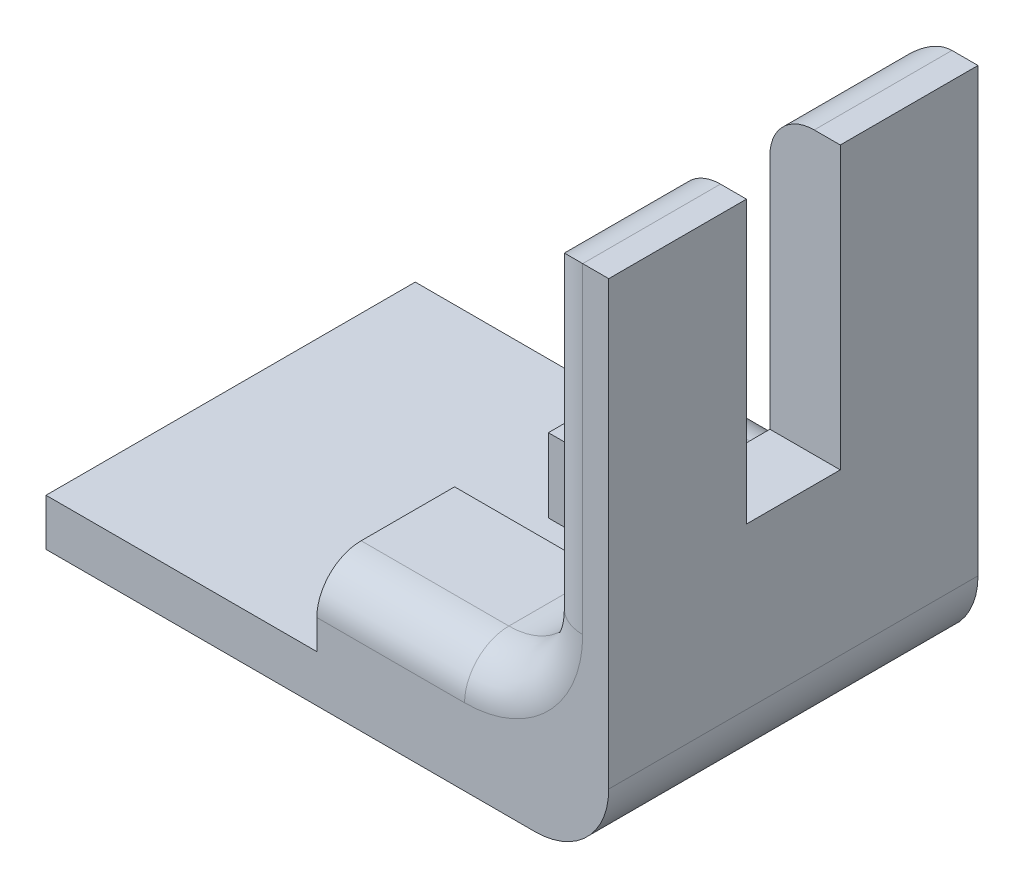
ISO-10303-21;
HEADER;
FILE_DESCRIPTION(('STEP AP214'),'2;1');
FILE_NAME('part.step','',(''),(''),'','','');
FILE_SCHEMA(('AUTOMOTIVE_DESIGN { 1 0 10303 214 1 1 1 1 }'));
ENDSEC;
DATA;
#1=APPLICATION_CONTEXT('core data for automotive mechanical design processes');
#2=APPLICATION_PROTOCOL_DEFINITION('international standard','automotive_design',2000,#1);
#3=PRODUCT_CONTEXT('',#1,'mechanical');
#4=PRODUCT('Part','Part','',(#3));
#5=PRODUCT_RELATED_PRODUCT_CATEGORY('part','',(#4));
#6=PRODUCT_DEFINITION_FORMATION('','',#4);
#7=PRODUCT_DEFINITION_CONTEXT('part definition',#1,'design');
#8=PRODUCT_DEFINITION('design','',#6,#7);
#9=PRODUCT_DEFINITION_SHAPE('','',#8);
#10=(LENGTH_UNIT() NAMED_UNIT(*) SI_UNIT(.MILLI.,.METRE.));
#11=(NAMED_UNIT(*) PLANE_ANGLE_UNIT() SI_UNIT($,.RADIAN.));
#12=(NAMED_UNIT(*) SI_UNIT($,.STERADIAN.) SOLID_ANGLE_UNIT());
#13=UNCERTAINTY_MEASURE_WITH_UNIT(LENGTH_MEASURE(1.E-05),#10,'distance_accuracy_value','');
#14=(GEOMETRIC_REPRESENTATION_CONTEXT(3) GLOBAL_UNCERTAINTY_ASSIGNED_CONTEXT((#13)) GLOBAL_UNIT_ASSIGNED_CONTEXT((#10,
#11,#12)) REPRESENTATION_CONTEXT('',''));
#15=CARTESIAN_POINT('',(0.,0.,0.));
#16=DIRECTION('',(0.,0.,1.));
#17=DIRECTION('',(1.,0.,0.));
#18=AXIS2_PLACEMENT_3D('',#15,#16,#17);
#19=CARTESIAN_POINT('',(-18.8607042124503,16.35,-11.4501236802198));
#20=DIRECTION('',(1.,0.,0.));
#21=DIRECTION('',(0.,0.,-1.));
#22=AXIS2_PLACEMENT_3D('',#19,#20,#21);
#23=PLANE('',#22);
#24=DIRECTION('',(0.,-1.,0.));
#25=VECTOR('',#24,1.);
#26=CARTESIAN_POINT('',(-18.8607042124503,16.35,38.5498763197802));
#27=LINE('',#26,#25);
#28=CARTESIAN_POINT('',(-18.8607042124503,10.35,38.5498763197802));
#29=VERTEX_POINT('',#28);
#30=CARTESIAN_POINT('',(-18.8607042124503,6.35,38.5498763197802));
#31=VERTEX_POINT('',#30);
#32=EDGE_CURVE('E237',#29,#31,#27,.T.);
#33=ORIENTED_EDGE('',*,*,#32,.F.);
#34=CARTESIAN_POINT('',(-18.8607042124503,10.35,32.5498763197802));
#35=DIRECTION('',(1.,0.,0.));
#36=DIRECTION('',(0.,0.,-1.));
#37=AXIS2_PLACEMENT_3D('',#34,#35,#36);
#38=CIRCLE('',#37,6.);
#39=CARTESIAN_POINT('',(-18.8607042124503,16.35,32.5498763197802));
#40=VERTEX_POINT('',#39);
#41=EDGE_CURVE('E333',#29,#40,#38,.F.);
#42=ORIENTED_EDGE('',*,*,#41,.T.);
#43=DIRECTION('',(0.,0.,1.));
#44=VECTOR('',#43,1.);
#45=CARTESIAN_POINT('',(-18.8607042124503,16.35,-11.4501236802198));
#46=LINE('',#45,#44);
#47=CARTESIAN_POINT('',(-18.8607042124503,16.35,19.8998763197802));
#48=VERTEX_POINT('',#47);
#49=EDGE_CURVE('E238',#48,#40,#46,.T.);
#50=ORIENTED_EDGE('',*,*,#49,.F.);
#51=DIRECTION('',(0.,1.,0.));
#52=VECTOR('',#51,1.);
#53=CARTESIAN_POINT('',(-18.8607042124503,6.35,19.8998763197802));
#54=LINE('',#53,#52);
#55=CARTESIAN_POINT('',(-18.8607042124503,6.35,19.8998763197802));
#56=VERTEX_POINT('',#55);
#57=EDGE_CURVE('E232',#56,#48,#54,.T.);
#58=ORIENTED_EDGE('',*,*,#57,.F.);
#59=DIRECTION('',(0.,0.,1.));
#60=VECTOR('',#59,1.);
#61=CARTESIAN_POINT('',(-18.8607042124503,6.35,-11.4501236802198));
#62=LINE('',#61,#60);
#63=EDGE_CURVE('E231',#56,#31,#62,.T.);
#64=ORIENTED_EDGE('',*,*,#63,.T.);
#65=EDGE_LOOP('',(#33,#42,#50,#58,#64));
#66=FACE_BOUND('',#65,.T.);
#67=ADVANCED_FACE('F35',(#66),#23,.F.);
#68=CARTESIAN_POINT('',(0.,16.35,0.));
#69=DIRECTION('',(0.,-1.,0.));
#70=DIRECTION('',(0.,0.,-1.));
#71=AXIS2_PLACEMENT_3D('',#68,#69,#70);
#72=PLANE('',#71);
#73=ORIENTED_EDGE('',*,*,#49,.T.);
#74=DIRECTION('',(1.,0.,0.));
#75=VECTOR('',#74,1.);
#76=CARTESIAN_POINT('',(0.,16.35,32.5498763197802));
#77=LINE('',#76,#75);
#78=CARTESIAN_POINT('',(1.1392957875497,16.35,32.5498763197802));
#79=VERTEX_POINT('',#78);
#80=EDGE_CURVE('E324',#40,#79,#77,.T.);
#81=ORIENTED_EDGE('',*,*,#80,.T.);
#82=DIRECTION('',(0.,0.,-1.));
#83=VECTOR('',#82,1.);
#84=CARTESIAN_POINT('',(1.1392957875497,16.35,19.8998763197802));
#85=LINE('',#84,#83);
#86=CARTESIAN_POINT('',(1.13929578754969,16.35,19.8998763197802));
#87=VERTEX_POINT('',#86);
#88=EDGE_CURVE('E304',#79,#87,#85,.T.);
#89=ORIENTED_EDGE('',*,*,#88,.T.);
#90=DIRECTION('',(1.,0.,0.));
#91=VECTOR('',#90,1.);
#92=CARTESIAN_POINT('',(-18.8607042124503,16.35,19.8998763197802));
#93=LINE('',#92,#91);
#94=EDGE_CURVE('E220',#48,#87,#93,.T.);
#95=ORIENTED_EDGE('',*,*,#94,.F.);
#96=EDGE_LOOP('',(#73,#81,#89,#95));
#97=FACE_BOUND('',#96,.T.);
#98=ADVANCED_FACE('F468',(#97),#72,.F.);
#99=CARTESIAN_POINT('',(0.,6.35,0.));
#100=DIRECTION('',(0.,1.,0.));
#101=DIRECTION('',(0.,0.,1.));
#102=AXIS2_PLACEMENT_3D('',#99,#100,#101);
#103=PLANE('',#102);
#104=DIRECTION('',(1.,0.,0.));
#105=VECTOR('',#104,1.);
#106=CARTESIAN_POINT('',(-55.5357042124503,6.35,38.5498763197802));
#107=LINE('',#106,#105);
#108=CARTESIAN_POINT('',(-55.5357042124503,6.35,38.5498763197802));
#109=VERTEX_POINT('',#108);
#110=EDGE_CURVE('E279',#109,#31,#107,.T.);
#111=ORIENTED_EDGE('',*,*,#110,.T.);
#112=ORIENTED_EDGE('',*,*,#63,.F.);
#113=DIRECTION('',(1.,0.,0.));
#114=VECTOR('',#113,1.);
#115=CARTESIAN_POINT('',(-18.8607042124503,6.35,19.8998763197802));
#116=LINE('',#115,#114);
#117=CARTESIAN_POINT('',(11.1392957875497,6.35,19.8998763197802));
#118=VERTEX_POINT('',#117);
#119=EDGE_CURVE('E206',#56,#118,#116,.T.);
#120=ORIENTED_EDGE('',*,*,#119,.T.);
#121=DIRECTION('',(0.,0.,-1.));
#122=VECTOR('',#121,1.);
#123=CARTESIAN_POINT('',(11.1392957875497,6.35,19.8998763197802));
#124=LINE('',#123,#122);
#125=CARTESIAN_POINT('',(11.1392957875497,6.35,7.1998763197802));
#126=VERTEX_POINT('',#125);
#127=EDGE_CURVE('E199',#118,#126,#124,.T.);
#128=ORIENTED_EDGE('',*,*,#127,.T.);
#129=DIRECTION('',(-1.,0.,0.));
#130=VECTOR('',#129,1.);
#131=CARTESIAN_POINT('',(-18.8607042124503,6.35,7.1998763197802));
#132=LINE('',#131,#130);
#133=CARTESIAN_POINT('',(-18.8607042124503,6.35,7.1998763197802));
#134=VERTEX_POINT('',#133);
#135=EDGE_CURVE('E209',#126,#134,#132,.T.);
#136=ORIENTED_EDGE('',*,*,#135,.T.);
#137=CARTESIAN_POINT('',(-18.8607042124503,6.35,-11.4501236802198));
#138=VERTEX_POINT('',#137);
#139=EDGE_CURVE('E239',#138,#134,#62,.T.);
#140=ORIENTED_EDGE('',*,*,#139,.F.);
#141=DIRECTION('',(-1.,0.,0.));
#142=VECTOR('',#141,1.);
#143=CARTESIAN_POINT('',(-55.5357042124503,6.35,-11.4501236802198));
#144=LINE('',#143,#142);
#145=CARTESIAN_POINT('',(-55.5357042124503,6.35,-11.4501236802198));
#146=VERTEX_POINT('',#145);
#147=EDGE_CURVE('E288',#138,#146,#144,.T.);
#148=ORIENTED_EDGE('',*,*,#147,.T.);
#149=DIRECTION('',(0.,0.,1.));
#150=VECTOR('',#149,1.);
#151=CARTESIAN_POINT('',(-55.5357042124503,6.35,-11.4501236802198));
#152=LINE('',#151,#150);
#153=EDGE_CURVE('E276',#146,#109,#152,.T.);
#154=ORIENTED_EDGE('',*,*,#153,.T.);
#155=EDGE_LOOP('',(#111,#112,#120,#128,#136,#140,#148,#154));
#156=FACE_BOUND('',#155,.T.);
#157=ADVANCED_FACE('F218',(#156),#103,.T.);
#158=CARTESIAN_POINT('',(11.1392957875497,69.85,-11.4501236802198));
#159=DIRECTION('',(1.,0.,0.));
#160=DIRECTION('',(0.,0.,-1.));
#161=AXIS2_PLACEMENT_3D('',#158,#159,#160);
#162=PLANE('',#161);
#163=DIRECTION('',(0.,0.,-1.));
#164=VECTOR('',#163,1.);
#165=CARTESIAN_POINT('',(11.1392957875497,26.35,38.5498763197802));
#166=LINE('',#165,#164);
#167=CARTESIAN_POINT('',(11.1392957875497,26.35,19.8998763197802));
#168=VERTEX_POINT('',#167);
#169=CARTESIAN_POINT('',(11.1392957875497,26.35,32.5498763197802));
#170=VERTEX_POINT('',#169);
#171=EDGE_CURVE('E301',#168,#170,#166,.F.);
#172=ORIENTED_EDGE('',*,*,#171,.T.);
#173=DIRECTION('',(0.,-1.,0.));
#174=VECTOR('',#173,1.);
#175=CARTESIAN_POINT('',(11.1392957875497,69.85,32.5498763197802));
#176=LINE('',#175,#174);
#177=CARTESIAN_POINT('',(11.1392957875497,63.85,32.5498763197802));
#178=VERTEX_POINT('',#177);
#179=EDGE_CURVE('E343',#170,#178,#176,.F.);
#180=ORIENTED_EDGE('',*,*,#179,.T.);
#181=DIRECTION('',(0.,0.,1.));
#182=VECTOR('',#181,1.);
#183=CARTESIAN_POINT('',(11.1392957875497,63.85,-11.4501236802198));
#184=LINE('',#183,#182);
#185=CARTESIAN_POINT('',(11.1392957875497,63.85,19.8998763197802));
#186=VERTEX_POINT('',#185);
#187=EDGE_CURVE('E341',#178,#186,#184,.F.);
#188=ORIENTED_EDGE('',*,*,#187,.T.);
#189=DIRECTION('',(0.,1.,0.));
#190=VECTOR('',#189,1.);
#191=CARTESIAN_POINT('',(11.1392957875497,31.75,19.8998763197802));
#192=LINE('',#191,#190);
#193=CARTESIAN_POINT('',(11.1392957875497,31.75,19.8998763197802));
#194=VERTEX_POINT('',#193);
#195=EDGE_CURVE('E249',#194,#186,#192,.T.);
#196=ORIENTED_EDGE('',*,*,#195,.F.);
#197=DIRECTION('',(0.,0.,1.));
#198=VECTOR('',#197,1.);
#199=CARTESIAN_POINT('',(11.1392957875497,31.75,19.8998763197802));
#200=LINE('',#199,#198);
#201=CARTESIAN_POINT('',(11.1392957875497,31.75,7.1998763197802));
#202=VERTEX_POINT('',#201);
#203=EDGE_CURVE('E246',#202,#194,#200,.T.);
#204=ORIENTED_EDGE('',*,*,#203,.F.);
#205=DIRECTION('',(0.,-1.,0.));
#206=VECTOR('',#205,1.);
#207=CARTESIAN_POINT('',(11.1392957875497,31.75,7.1998763197802));
#208=LINE('',#207,#206);
#209=CARTESIAN_POINT('',(11.1392957875497,63.85,7.1998763197802));
#210=VERTEX_POINT('',#209);
#211=EDGE_CURVE('E244',#210,#202,#208,.T.);
#212=ORIENTED_EDGE('',*,*,#211,.F.);
#213=DIRECTION('',(0.,0.,1.));
#214=VECTOR('',#213,1.);
#215=CARTESIAN_POINT('',(11.1392957875497,63.85,-11.4501236802198));
#216=LINE('',#215,#214);
#217=CARTESIAN_POINT('',(11.1392957875497,63.85,-5.4501236802198));
#218=VERTEX_POINT('',#217);
#219=EDGE_CURVE('E337',#210,#218,#216,.F.);
#220=ORIENTED_EDGE('',*,*,#219,.T.);
#221=DIRECTION('',(0.,-1.,0.));
#222=VECTOR('',#221,1.);
#223=CARTESIAN_POINT('',(11.1392957875497,69.85,-5.4501236802198));
#224=LINE('',#223,#222);
#225=CARTESIAN_POINT('',(11.1392957875497,26.35,-5.4501236802198));
#226=VERTEX_POINT('',#225);
#227=EDGE_CURVE('E339',#218,#226,#224,.T.);
#228=ORIENTED_EDGE('',*,*,#227,.T.);
#229=DIRECTION('',(0.,0.,-1.));
#230=VECTOR('',#229,1.);
#231=CARTESIAN_POINT('',(11.1392957875497,26.35,7.1998763197802));
#232=LINE('',#231,#230);
#233=CARTESIAN_POINT('',(11.1392957875497,26.35,7.1998763197802));
#234=VERTEX_POINT('',#233);
#235=EDGE_CURVE('E202',#226,#234,#232,.F.);
#236=ORIENTED_EDGE('',*,*,#235,.T.);
#237=DIRECTION('',(0.,1.,0.));
#238=VECTOR('',#237,1.);
#239=CARTESIAN_POINT('',(11.1392957875497,6.35,7.1998763197802));
#240=LINE('',#239,#238);
#241=EDGE_CURVE('E194',#126,#234,#240,.T.);
#242=ORIENTED_EDGE('',*,*,#241,.F.);
#243=ORIENTED_EDGE('',*,*,#127,.F.);
#244=DIRECTION('',(0.,1.,0.));
#245=VECTOR('',#244,1.);
#246=CARTESIAN_POINT('',(11.1392957875497,6.35,19.8998763197802));
#247=LINE('',#246,#245);
#248=EDGE_CURVE('E229',#118,#168,#247,.T.);
#249=ORIENTED_EDGE('',*,*,#248,.T.);
#250=EDGE_LOOP('',(#172,#180,#188,#196,#204,#212,#220,#228,#236,#242,#243,#249));
#251=FACE_BOUND('',#250,.T.);
#252=ADVANCED_FACE('F197',(#251),#162,.F.);
#253=CARTESIAN_POINT('',(0.,69.85,0.));
#254=DIRECTION('',(0.,-1.,0.));
#255=DIRECTION('',(0.,0.,-1.));
#256=AXIS2_PLACEMENT_3D('',#253,#254,#255);
#257=PLANE('',#256);
#258=DIRECTION('',(-1.,0.,0.));
#259=VECTOR('',#258,1.);
#260=CARTESIAN_POINT('',(20.6642957875497,69.85,-11.4501236802198));
#261=LINE('',#260,#259);
#262=CARTESIAN_POINT('',(20.6642957875497,69.85,-11.4501236802198));
#263=VERTEX_POINT('',#262);
#264=CARTESIAN_POINT('',(17.1392957875497,69.85,-11.4501236802198));
#265=VERTEX_POINT('',#264);
#266=EDGE_CURVE('E270',#263,#265,#261,.T.);
#267=ORIENTED_EDGE('',*,*,#266,.T.);
#268=DIRECTION('',(0.,0.,1.));
#269=VECTOR('',#268,1.);
#270=CARTESIAN_POINT('',(17.1392957875497,69.85,0.));
#271=LINE('',#270,#269);
#272=CARTESIAN_POINT('',(17.1392957875497,69.85,7.1998763197802));
#273=VERTEX_POINT('',#272);
#274=EDGE_CURVE('E349',#265,#273,#271,.T.);
#275=ORIENTED_EDGE('',*,*,#274,.T.);
#276=DIRECTION('',(1.,0.,0.));
#277=VECTOR('',#276,1.);
#278=CARTESIAN_POINT('',(0.,69.85,7.1998763197802));
#279=LINE('',#278,#277);
#280=CARTESIAN_POINT('',(20.6642957875497,69.85,7.19987631978019));
#281=VERTEX_POINT('',#280);
#282=EDGE_CURVE('E294',#273,#281,#279,.T.);
#283=ORIENTED_EDGE('',*,*,#282,.T.);
#284=DIRECTION('',(0.,0.,-1.));
#285=VECTOR('',#284,1.);
#286=CARTESIAN_POINT('',(20.6642957875497,69.85,-11.4501236802198));
#287=LINE('',#286,#285);
#288=EDGE_CURVE('E266',#281,#263,#287,.T.);
#289=ORIENTED_EDGE('',*,*,#288,.T.);
#290=EDGE_LOOP('',(#267,#275,#283,#289));
#291=FACE_BOUND('',#290,.T.);
#292=ADVANCED_FACE('F430',(#291),#257,.F.);
#293=CARTESIAN_POINT('',(-55.5357042124503,6.35,-11.4501236802198));
#294=DIRECTION('',(1.,0.,0.));
#295=DIRECTION('',(0.,0.,-1.));
#296=AXIS2_PLACEMENT_3D('',#293,#294,#295);
#297=PLANE('',#296);
#298=DIRECTION('',(0.,0.,1.));
#299=VECTOR('',#298,1.);
#300=CARTESIAN_POINT('',(-55.5357042124503,0.,-11.4501236802198));
#301=LINE('',#300,#299);
#302=CARTESIAN_POINT('',(-55.5357042124503,0.,-11.4501236802198));
#303=VERTEX_POINT('',#302);
#304=CARTESIAN_POINT('',(-55.5357042124503,0.,38.5498763197802));
#305=VERTEX_POINT('',#304);
#306=EDGE_CURVE('E275',#303,#305,#301,.T.);
#307=ORIENTED_EDGE('',*,*,#306,.T.);
#308=DIRECTION('',(0.,-1.,0.));
#309=VECTOR('',#308,1.);
#310=CARTESIAN_POINT('',(-55.5357042124503,6.35,38.5498763197802));
#311=LINE('',#310,#309);
#312=EDGE_CURVE('E289',#109,#305,#311,.T.);
#313=ORIENTED_EDGE('',*,*,#312,.F.);
#314=ORIENTED_EDGE('',*,*,#153,.F.);
#315=DIRECTION('',(0.,-1.,0.));
#316=VECTOR('',#315,1.);
#317=CARTESIAN_POINT('',(-55.5357042124503,6.35,-11.4501236802198));
#318=LINE('',#317,#316);
#319=EDGE_CURVE('E298',#146,#303,#318,.T.);
#320=ORIENTED_EDGE('',*,*,#319,.T.);
#321=EDGE_LOOP('',(#307,#313,#314,#320));
#322=FACE_BOUND('',#321,.T.);
#323=ADVANCED_FACE('F396',(#322),#297,.F.);
#324=CARTESIAN_POINT('',(-55.5357042124503,6.35,38.5498763197802));
#325=DIRECTION('',(0.,0.,-1.));
#326=DIRECTION('',(-1.,0.,0.));
#327=AXIS2_PLACEMENT_3D('',#324,#325,#326);
#328=PLANE('',#327);
#329=DIRECTION('',(1.,0.,0.));
#330=VECTOR('',#329,1.);
#331=CARTESIAN_POINT('',(-55.5357042124503,0.,38.5498763197802));
#332=LINE('',#331,#330);
#333=CARTESIAN_POINT('',(10.6642957875497,0.,38.5498763197802));
#334=VERTEX_POINT('',#333);
#335=EDGE_CURVE('E391',#305,#334,#332,.T.);
#336=ORIENTED_EDGE('',*,*,#335,.T.);
#337=CARTESIAN_POINT('',(10.6642957875497,10.,38.5498763197802));
#338=DIRECTION('',(0.,0.,-1.));
#339=DIRECTION('',(-1.,0.,0.));
#340=AXIS2_PLACEMENT_3D('',#337,#338,#339);
#341=CIRCLE('',#340,10.);
#342=CARTESIAN_POINT('',(20.6642957875497,10.,38.5498763197802));
#343=VERTEX_POINT('',#342);
#344=EDGE_CURVE('E11',#334,#343,#341,.F.);
#345=ORIENTED_EDGE('',*,*,#344,.T.);
#346=DIRECTION('',(0.,-1.,0.));
#347=VECTOR('',#346,1.);
#348=CARTESIAN_POINT('',(20.6642957875497,6.35,38.5498763197802));
#349=LINE('',#348,#347);
#350=CARTESIAN_POINT('',(20.6642957875497,69.85,38.5498763197802));
#351=VERTEX_POINT('',#350);
#352=EDGE_CURVE('E382',#351,#343,#349,.T.);
#353=ORIENTED_EDGE('',*,*,#352,.F.);
#354=DIRECTION('',(1.,0.,0.));
#355=VECTOR('',#354,1.);
#356=CARTESIAN_POINT('',(20.6642957875497,69.85,38.5498763197802));
#357=LINE('',#356,#355);
#358=CARTESIAN_POINT('',(17.1392957875497,69.85,38.5498763197802));
#359=VERTEX_POINT('',#358);
#360=EDGE_CURVE('E273',#359,#351,#357,.T.);
#361=ORIENTED_EDGE('',*,*,#360,.F.);
#362=DIRECTION('',(0.,-1.,0.));
#363=VECTOR('',#362,1.);
#364=CARTESIAN_POINT('',(17.1392957875497,6.35,38.5498763197802));
#365=LINE('',#364,#363);
#366=CARTESIAN_POINT('',(17.1392957875497,26.35,38.5498763197802));
#367=VERTEX_POINT('',#366);
#368=EDGE_CURVE('E327',#359,#367,#365,.T.);
#369=ORIENTED_EDGE('',*,*,#368,.T.);
#370=CARTESIAN_POINT('',(1.1392957875497,26.35,38.5498763197802));
#371=DIRECTION('',(0.,0.,-1.));
#372=DIRECTION('',(-1.,0.,0.));
#373=AXIS2_PLACEMENT_3D('',#370,#371,#372);
#374=CIRCLE('',#373,16.);
#375=CARTESIAN_POINT('',(1.1392957875497,10.35,38.5498763197802));
#376=VERTEX_POINT('',#375);
#377=EDGE_CURVE('E329',#367,#376,#374,.T.);
#378=ORIENTED_EDGE('',*,*,#377,.T.);
#379=DIRECTION('',(1.,0.,0.));
#380=VECTOR('',#379,1.);
#381=CARTESIAN_POINT('',(-55.5357042124503,10.35,38.5498763197802));
#382=LINE('',#381,#380);
#383=EDGE_CURVE('E331',#376,#29,#382,.F.);
#384=ORIENTED_EDGE('',*,*,#383,.T.);
#385=ORIENTED_EDGE('',*,*,#32,.T.);
#386=ORIENTED_EDGE('',*,*,#110,.F.);
#387=ORIENTED_EDGE('',*,*,#312,.T.);
#388=EDGE_LOOP('',(#336,#345,#353,#361,#369,#378,#384,#385,#386,#387));
#389=FACE_BOUND('',#388,.T.);
#390=ADVANCED_FACE('F402',(#389),#328,.F.);
#391=CARTESIAN_POINT('',(20.6642957875497,6.35,-11.4501236802198));
#392=DIRECTION('',(-1.,0.,0.));
#393=DIRECTION('',(0.,0.,1.));
#394=AXIS2_PLACEMENT_3D('',#391,#392,#393);
#395=PLANE('',#394);
#396=ORIENTED_EDGE('',*,*,#352,.T.);
#397=DIRECTION('',(0.,0.,-1.));
#398=VECTOR('',#397,1.);
#399=CARTESIAN_POINT('',(20.6642957875497,10.,-11.4501236802198));
#400=LINE('',#399,#398);
#401=CARTESIAN_POINT('',(20.6642957875497,10.,-11.4501236802198));
#402=VERTEX_POINT('',#401);
#403=EDGE_CURVE('E353',#343,#402,#400,.T.);
#404=ORIENTED_EDGE('',*,*,#403,.T.);
#405=DIRECTION('',(0.,-1.,0.));
#406=VECTOR('',#405,1.);
#407=CARTESIAN_POINT('',(20.6642957875497,6.35,-11.4501236802198));
#408=LINE('',#407,#406);
#409=EDGE_CURVE('E378',#263,#402,#408,.T.);
#410=ORIENTED_EDGE('',*,*,#409,.F.);
#411=ORIENTED_EDGE('',*,*,#288,.F.);
#412=DIRECTION('',(0.,-1.,0.));
#413=VECTOR('',#412,1.);
#414=CARTESIAN_POINT('',(20.6642957875497,6.35,7.1998763197802));
#415=LINE('',#414,#413);
#416=CARTESIAN_POINT('',(20.6642957875497,31.75,7.1998763197802));
#417=VERTEX_POINT('',#416);
#418=EDGE_CURVE('E260',#281,#417,#415,.T.);
#419=ORIENTED_EDGE('',*,*,#418,.T.);
#420=DIRECTION('',(0.,0.,1.));
#421=VECTOR('',#420,1.);
#422=CARTESIAN_POINT('',(20.6642957875497,31.75,-11.4501236802198));
#423=LINE('',#422,#421);
#424=CARTESIAN_POINT('',(20.6642957875497,31.75,19.8998763197802));
#425=VERTEX_POINT('',#424);
#426=EDGE_CURVE('E263',#417,#425,#423,.T.);
#427=ORIENTED_EDGE('',*,*,#426,.T.);
#428=DIRECTION('',(0.,1.,0.));
#429=VECTOR('',#428,1.);
#430=CARTESIAN_POINT('',(20.6642957875497,6.35,19.8998763197802));
#431=LINE('',#430,#429);
#432=CARTESIAN_POINT('',(20.6642957875497,69.85,19.8998763197802));
#433=VERTEX_POINT('',#432);
#434=EDGE_CURVE('E255',#425,#433,#431,.T.);
#435=ORIENTED_EDGE('',*,*,#434,.T.);
#436=EDGE_CURVE('E267',#351,#433,#287,.T.);
#437=ORIENTED_EDGE('',*,*,#436,.F.);
#438=EDGE_LOOP('',(#396,#404,#410,#411,#419,#427,#435,#437));
#439=FACE_BOUND('',#438,.T.);
#440=ADVANCED_FACE('F376',(#439),#395,.F.);
#441=CARTESIAN_POINT('',(-55.5357042124503,6.35,-11.4501236802198));
#442=DIRECTION('',(0.,0.,1.));
#443=DIRECTION('',(1.,0.,0.));
#444=AXIS2_PLACEMENT_3D('',#441,#442,#443);
#445=PLANE('',#444);
#446=ORIENTED_EDGE('',*,*,#409,.T.);
#447=CARTESIAN_POINT('',(10.6642957875497,10.,-11.4501236802198));
#448=DIRECTION('',(0.,0.,1.));
#449=DIRECTION('',(1.,0.,0.));
#450=AXIS2_PLACEMENT_3D('',#447,#448,#449);
#451=CIRCLE('',#450,10.);
#452=CARTESIAN_POINT('',(10.6642957875497,0.,-11.4501236802198));
#453=VERTEX_POINT('',#452);
#454=EDGE_CURVE('E57',#402,#453,#451,.F.);
#455=ORIENTED_EDGE('',*,*,#454,.T.);
#456=DIRECTION('',(-1.,0.,0.));
#457=VECTOR('',#456,1.);
#458=CARTESIAN_POINT('',(-55.5357042124503,0.,-11.4501236802198));
#459=LINE('',#458,#457);
#460=EDGE_CURVE('E280',#453,#303,#459,.T.);
#461=ORIENTED_EDGE('',*,*,#460,.T.);
#462=ORIENTED_EDGE('',*,*,#319,.F.);
#463=ORIENTED_EDGE('',*,*,#147,.F.);
#464=DIRECTION('',(0.,-1.,0.));
#465=VECTOR('',#464,1.);
#466=CARTESIAN_POINT('',(-18.8607042124503,16.35,-11.4501236802198));
#467=LINE('',#466,#465);
#468=CARTESIAN_POINT('',(-18.8607042124503,10.35,-11.4501236802198));
#469=VERTEX_POINT('',#468);
#470=EDGE_CURVE('E242',#469,#138,#467,.T.);
#471=ORIENTED_EDGE('',*,*,#470,.F.);
#472=DIRECTION('',(-1.,0.,0.));
#473=VECTOR('',#472,1.);
#474=CARTESIAN_POINT('',(-55.5357042124503,10.35,-11.4501236802198));
#475=LINE('',#474,#473);
#476=CARTESIAN_POINT('',(1.13929578754969,10.35,-11.4501236802198));
#477=VERTEX_POINT('',#476);
#478=EDGE_CURVE('E320',#469,#477,#475,.F.);
#479=ORIENTED_EDGE('',*,*,#478,.T.);
#480=CARTESIAN_POINT('',(1.13929578754969,26.35,-11.4501236802198));
#481=DIRECTION('',(0.,0.,1.));
#482=DIRECTION('',(1.,0.,0.));
#483=AXIS2_PLACEMENT_3D('',#480,#481,#482);
#484=CIRCLE('',#483,16.);
#485=CARTESIAN_POINT('',(17.1392957875497,26.35,-11.4501236802198));
#486=VERTEX_POINT('',#485);
#487=EDGE_CURVE('E318',#477,#486,#484,.T.);
#488=ORIENTED_EDGE('',*,*,#487,.T.);
#489=DIRECTION('',(0.,-1.,0.));
#490=VECTOR('',#489,1.);
#491=CARTESIAN_POINT('',(17.1392957875497,6.35,-11.4501236802198));
#492=LINE('',#491,#490);
#493=EDGE_CURVE('E316',#486,#265,#492,.F.);
#494=ORIENTED_EDGE('',*,*,#493,.T.);
#495=ORIENTED_EDGE('',*,*,#266,.F.);
#496=EDGE_LOOP('',(#446,#455,#461,#462,#463,#471,#479,#488,#494,#495));
#497=FACE_BOUND('',#496,.T.);
#498=ADVANCED_FACE('F385',(#497),#445,.F.);
#499=CARTESIAN_POINT('',(0.,0.,0.));
#500=DIRECTION('',(0.,1.,0.));
#501=DIRECTION('',(0.,0.,1.));
#502=AXIS2_PLACEMENT_3D('',#499,#500,#501);
#503=PLANE('',#502);
#504=ORIENTED_EDGE('',*,*,#460,.F.);
#505=DIRECTION('',(0.,0.,-1.));
#506=VECTOR('',#505,1.);
#507=CARTESIAN_POINT('',(10.6642957875497,0.,0.));
#508=LINE('',#507,#506);
#509=EDGE_CURVE('E43',#453,#334,#508,.F.);
#510=ORIENTED_EDGE('',*,*,#509,.T.);
#511=ORIENTED_EDGE('',*,*,#335,.F.);
#512=ORIENTED_EDGE('',*,*,#306,.F.);
#513=EDGE_LOOP('',(#504,#510,#511,#512));
#514=FACE_BOUND('',#513,.T.);
#515=ADVANCED_FACE('F400',(#514),#503,.F.);
#516=DIRECTION('',(-1.,0.,0.));
#517=VECTOR('',#516,1.);
#518=CARTESIAN_POINT('',(0.,69.85,19.8998763197802));
#519=LINE('',#518,#517);
#520=CARTESIAN_POINT('',(17.1392957875497,69.85,19.8998763197802));
#521=VERTEX_POINT('',#520);
#522=EDGE_CURVE('E291',#433,#521,#519,.T.);
#523=ORIENTED_EDGE('',*,*,#522,.T.);
#524=DIRECTION('',(0.,0.,1.));
#525=VECTOR('',#524,1.);
#526=CARTESIAN_POINT('',(17.1392957875497,69.85,0.));
#527=LINE('',#526,#525);
#528=EDGE_CURVE('E345',#521,#359,#527,.T.);
#529=ORIENTED_EDGE('',*,*,#528,.T.);
#530=ORIENTED_EDGE('',*,*,#360,.T.);
#531=ORIENTED_EDGE('',*,*,#436,.T.);
#532=EDGE_LOOP('',(#523,#529,#530,#531));
#533=FACE_BOUND('',#532,.T.);
#534=ADVANCED_FACE('F446',(#533),#257,.F.);
#535=CARTESIAN_POINT('',(74.6392957875497,31.75,19.8998763197802));
#536=DIRECTION('',(0.,-1.,0.));
#537=DIRECTION('',(0.,0.,-1.));
#538=AXIS2_PLACEMENT_3D('',#535,#536,#537);
#539=PLANE('',#538);
#540=DIRECTION('',(-1.,0.,0.));
#541=VECTOR('',#540,1.);
#542=CARTESIAN_POINT('',(74.6392957875497,31.75,7.19987631978019));
#543=LINE('',#542,#541);
#544=EDGE_CURVE('E252',#417,#202,#543,.T.);
#545=ORIENTED_EDGE('',*,*,#544,.T.);
#546=ORIENTED_EDGE('',*,*,#203,.T.);
#547=DIRECTION('',(-1.,0.,0.));
#548=VECTOR('',#547,1.);
#549=CARTESIAN_POINT('',(74.6392957875497,31.75,19.8998763197802));
#550=LINE('',#549,#548);
#551=EDGE_CURVE('E253',#425,#194,#550,.T.);
#552=ORIENTED_EDGE('',*,*,#551,.F.);
#553=ORIENTED_EDGE('',*,*,#426,.F.);
#554=EDGE_LOOP('',(#545,#546,#552,#553));
#555=FACE_BOUND('',#554,.T.);
#556=ADVANCED_FACE('F438',(#555),#539,.F.);
#557=CARTESIAN_POINT('',(74.6392957875497,31.75,7.19987631978019));
#558=DIRECTION('',(0.,0.,-1.));
#559=DIRECTION('',(-1.,0.,0.));
#560=AXIS2_PLACEMENT_3D('',#557,#558,#559);
#561=PLANE('',#560);
#562=ORIENTED_EDGE('',*,*,#282,.F.);
#563=CARTESIAN_POINT('',(17.1392957875497,63.85,7.1998763197802));
#564=DIRECTION('',(0.,0.,-1.));
#565=DIRECTION('',(-1.,0.,0.));
#566=AXIS2_PLACEMENT_3D('',#563,#564,#565);
#567=CIRCLE('',#566,6.);
#568=EDGE_CURVE('E351',#273,#210,#567,.F.);
#569=ORIENTED_EDGE('',*,*,#568,.T.);
#570=ORIENTED_EDGE('',*,*,#211,.T.);
#571=ORIENTED_EDGE('',*,*,#544,.F.);
#572=ORIENTED_EDGE('',*,*,#418,.F.);
#573=EDGE_LOOP('',(#562,#569,#570,#571,#572));
#574=FACE_BOUND('',#573,.T.);
#575=ADVANCED_FACE('F433',(#574),#561,.F.);
#576=CARTESIAN_POINT('',(74.6392957875497,31.75,19.8998763197802));
#577=DIRECTION('',(0.,0.,1.));
#578=DIRECTION('',(1.,0.,0.));
#579=AXIS2_PLACEMENT_3D('',#576,#577,#578);
#580=PLANE('',#579);
#581=ORIENTED_EDGE('',*,*,#195,.T.);
#582=CARTESIAN_POINT('',(17.1392957875497,63.85,19.8998763197802));
#583=DIRECTION('',(0.,0.,1.));
#584=DIRECTION('',(1.,0.,0.));
#585=AXIS2_PLACEMENT_3D('',#582,#583,#584);
#586=CIRCLE('',#585,6.);
#587=EDGE_CURVE('E347',#186,#521,#586,.F.);
#588=ORIENTED_EDGE('',*,*,#587,.T.);
#589=ORIENTED_EDGE('',*,*,#522,.F.);
#590=ORIENTED_EDGE('',*,*,#434,.F.);
#591=ORIENTED_EDGE('',*,*,#551,.T.);
#592=EDGE_LOOP('',(#581,#588,#589,#590,#591));
#593=FACE_BOUND('',#592,.T.);
#594=ADVANCED_FACE('F442',(#593),#580,.F.);
#595=CARTESIAN_POINT('',(-18.8607042124503,16.35,-5.45012368021981));
#596=VERTEX_POINT('',#595);
#597=CARTESIAN_POINT('',(-18.8607042124503,16.35,7.1998763197802));
#598=VERTEX_POINT('',#597);
#599=EDGE_CURVE('E235',#596,#598,#46,.T.);
#600=ORIENTED_EDGE('',*,*,#599,.F.);
#601=CARTESIAN_POINT('',(-18.8607042124503,10.35,-5.4501236802198));
#602=DIRECTION('',(1.,0.,0.));
#603=DIRECTION('',(0.,0.,-1.));
#604=AXIS2_PLACEMENT_3D('',#601,#602,#603);
#605=CIRCLE('',#604,6.);
#606=EDGE_CURVE('E314',#596,#469,#605,.F.);
#607=ORIENTED_EDGE('',*,*,#606,.T.);
#608=ORIENTED_EDGE('',*,*,#470,.T.);
#609=ORIENTED_EDGE('',*,*,#139,.T.);
#610=DIRECTION('',(0.,1.,0.));
#611=VECTOR('',#610,1.);
#612=CARTESIAN_POINT('',(-18.8607042124503,6.35,7.1998763197802));
#613=LINE('',#612,#611);
#614=EDGE_CURVE('E205',#134,#598,#613,.T.);
#615=ORIENTED_EDGE('',*,*,#614,.T.);
#616=EDGE_LOOP('',(#600,#607,#608,#609,#615));
#617=FACE_BOUND('',#616,.T.);
#618=ADVANCED_FACE('F471',(#617),#23,.F.);
#619=DIRECTION('',(0.,0.,-1.));
#620=VECTOR('',#619,1.);
#621=CARTESIAN_POINT('',(1.13929578754969,16.35,-11.4501236802198));
#622=LINE('',#621,#620);
#623=CARTESIAN_POINT('',(1.13929578754969,16.35,7.1998763197802));
#624=VERTEX_POINT('',#623);
#625=CARTESIAN_POINT('',(1.13929578754969,16.35,-5.4501236802198));
#626=VERTEX_POINT('',#625);
#627=EDGE_CURVE('E296',#624,#626,#622,.T.);
#628=ORIENTED_EDGE('',*,*,#627,.T.);
#629=DIRECTION('',(-1.,0.,0.));
#630=VECTOR('',#629,1.);
#631=CARTESIAN_POINT('',(0.,16.35,-5.4501236802198));
#632=LINE('',#631,#630);
#633=EDGE_CURVE('E311',#626,#596,#632,.T.);
#634=ORIENTED_EDGE('',*,*,#633,.T.);
#635=ORIENTED_EDGE('',*,*,#599,.T.);
#636=DIRECTION('',(-1.,0.,0.));
#637=VECTOR('',#636,1.);
#638=CARTESIAN_POINT('',(-18.8607042124503,16.35,7.1998763197802));
#639=LINE('',#638,#637);
#640=EDGE_CURVE('E223',#624,#598,#639,.T.);
#641=ORIENTED_EDGE('',*,*,#640,.F.);
#642=EDGE_LOOP('',(#628,#634,#635,#641));
#643=FACE_BOUND('',#642,.T.);
#644=ADVANCED_FACE('F477',(#643),#72,.F.);
#645=CARTESIAN_POINT('',(-18.8607042124503,6.35,19.8998763197802));
#646=DIRECTION('',(0.,0.,1.));
#647=DIRECTION('',(1.,0.,0.));
#648=AXIS2_PLACEMENT_3D('',#645,#646,#647);
#649=PLANE('',#648);
#650=ORIENTED_EDGE('',*,*,#94,.T.);
#651=CARTESIAN_POINT('',(1.1392957875497,26.35,19.8998763197802));
#652=DIRECTION('',(0.,0.,1.));
#653=DIRECTION('',(1.,0.,0.));
#654=AXIS2_PLACEMENT_3D('',#651,#652,#653);
#655=CIRCLE('',#654,10.);
#656=EDGE_CURVE('E308',#87,#168,#655,.T.);
#657=ORIENTED_EDGE('',*,*,#656,.T.);
#658=ORIENTED_EDGE('',*,*,#248,.F.);
#659=ORIENTED_EDGE('',*,*,#119,.F.);
#660=ORIENTED_EDGE('',*,*,#57,.T.);
#661=EDGE_LOOP('',(#650,#657,#658,#659,#660));
#662=FACE_BOUND('',#661,.T.);
#663=ADVANCED_FACE('F484',(#662),#649,.F.);
#664=CARTESIAN_POINT('',(-18.8607042124503,6.35,7.1998763197802));
#665=DIRECTION('',(0.,0.,-1.));
#666=DIRECTION('',(-1.,0.,0.));
#667=AXIS2_PLACEMENT_3D('',#664,#665,#666);
#668=PLANE('',#667);
#669=ORIENTED_EDGE('',*,*,#241,.T.);
#670=CARTESIAN_POINT('',(1.13929578754969,26.35,7.1998763197802));
#671=DIRECTION('',(0.,0.,-1.));
#672=DIRECTION('',(-1.,0.,0.));
#673=AXIS2_PLACEMENT_3D('',#670,#671,#672);
#674=CIRCLE('',#673,10.);
#675=EDGE_CURVE('E306',#234,#624,#674,.T.);
#676=ORIENTED_EDGE('',*,*,#675,.T.);
#677=ORIENTED_EDGE('',*,*,#640,.T.);
#678=ORIENTED_EDGE('',*,*,#614,.F.);
#679=ORIENTED_EDGE('',*,*,#135,.F.);
#680=EDGE_LOOP('',(#669,#676,#677,#678,#679));
#681=FACE_BOUND('',#680,.T.);
#682=ADVANCED_FACE('F210',(#681),#668,.F.);
#683=CARTESIAN_POINT('',(1.13929578754969,26.35,0.));
#684=DIRECTION('',(0.,0.,1.));
#685=DIRECTION('',(1.,0.,0.));
#686=AXIS2_PLACEMENT_3D('',#683,#684,#685);
#687=CYLINDRICAL_SURFACE('',#686,10.);
#688=ORIENTED_EDGE('',*,*,#235,.F.);
#689=CARTESIAN_POINT('',(1.13929578754969,26.35,-5.4501236802198));
#690=DIRECTION('',(0.,0.,1.));
#691=DIRECTION('',(1.,0.,0.));
#692=AXIS2_PLACEMENT_3D('',#689,#690,#691);
#693=CIRCLE('',#692,10.);
#694=EDGE_CURVE('E322',#226,#626,#693,.F.);
#695=ORIENTED_EDGE('',*,*,#694,.T.);
#696=ORIENTED_EDGE('',*,*,#627,.F.);
#697=ORIENTED_EDGE('',*,*,#675,.F.);
#698=EDGE_LOOP('',(#688,#695,#696,#697));
#699=FACE_BOUND('',#698,.T.);
#700=ADVANCED_FACE('F490',(#699),#687,.F.);
#701=CARTESIAN_POINT('',(1.13929578754969,26.35,0.));
#702=DIRECTION('',(0.,0.,1.));
#703=DIRECTION('',(1.,0.,0.));
#704=AXIS2_PLACEMENT_3D('',#701,#702,#703);
#705=CYLINDRICAL_SURFACE('',#704,10.);
#706=ORIENTED_EDGE('',*,*,#88,.F.);
#707=CARTESIAN_POINT('',(1.1392957875497,26.35,32.5498763197802));
#708=DIRECTION('',(0.,0.,-1.));
#709=DIRECTION('',(-1.,0.,0.));
#710=AXIS2_PLACEMENT_3D('',#707,#708,#709);
#711=CIRCLE('',#710,10.);
#712=EDGE_CURVE('E335',#79,#170,#711,.F.);
#713=ORIENTED_EDGE('',*,*,#712,.T.);
#714=ORIENTED_EDGE('',*,*,#171,.F.);
#715=ORIENTED_EDGE('',*,*,#656,.F.);
#716=EDGE_LOOP('',(#706,#713,#714,#715));
#717=FACE_BOUND('',#716,.T.);
#718=ADVANCED_FACE('F492',(#717),#705,.F.);
#719=CARTESIAN_POINT('',(17.1392957875497,63.85,0.));
#720=DIRECTION('',(0.,0.,1.));
#721=DIRECTION('',(1.,0.,0.));
#722=AXIS2_PLACEMENT_3D('',#719,#720,#721);
#723=CYLINDRICAL_SURFACE('',#722,6.);
#724=ORIENTED_EDGE('',*,*,#568,.F.);
#725=ORIENTED_EDGE('',*,*,#274,.F.);
#726=CARTESIAN_POINT('',(17.1392957875497,63.85,-5.4501236802198));
#727=DIRECTION('',(0.,0.707106781186547,0.707106781186547));
#728=DIRECTION('',(0.,-0.707106781186547,0.707106781186547));
#729=AXIS2_PLACEMENT_3D('',#726,#727,#728);
#730=ELLIPSE('',#729,8.48528137423857,6.);
#731=EDGE_CURVE('E227',#218,#265,#730,.F.);
#732=ORIENTED_EDGE('',*,*,#731,.F.);
#733=ORIENTED_EDGE('',*,*,#219,.F.);
#734=EDGE_LOOP('',(#724,#725,#732,#733));
#735=FACE_BOUND('',#734,.T.);
#736=ADVANCED_FACE('F427',(#735),#723,.T.);
#737=CARTESIAN_POINT('',(17.1392957875497,69.85,-5.4501236802198));
#738=DIRECTION('',(0.,-1.,0.));
#739=DIRECTION('',(0.,0.,-1.));
#740=AXIS2_PLACEMENT_3D('',#737,#738,#739);
#741=CYLINDRICAL_SURFACE('',#740,6.);
#742=ORIENTED_EDGE('',*,*,#731,.T.);
#743=ORIENTED_EDGE('',*,*,#493,.F.);
#744=CARTESIAN_POINT('',(17.1392957875497,26.35,-5.4501236802198));
#745=DIRECTION('',(0.,-1.,0.));
#746=DIRECTION('',(0.,0.,-1.));
#747=AXIS2_PLACEMENT_3D('',#744,#745,#746);
#748=CIRCLE('',#747,6.);
#749=EDGE_CURVE('E357',#226,#486,#748,.T.);
#750=ORIENTED_EDGE('',*,*,#749,.F.);
#751=ORIENTED_EDGE('',*,*,#227,.F.);
#752=EDGE_LOOP('',(#742,#743,#750,#751));
#753=FACE_BOUND('',#752,.T.);
#754=ADVANCED_FACE('F420',(#753),#741,.T.);
#755=CARTESIAN_POINT('',(1.13929578754969,26.35,-5.4501236802198));
#756=DIRECTION('',(0.,0.,1.));
#757=DIRECTION('',(1.,0.,0.));
#758=AXIS2_PLACEMENT_3D('',#755,#756,#757);
#759=TOROIDAL_SURFACE('',#758,16.,6.);
#760=ORIENTED_EDGE('',*,*,#749,.T.);
#761=ORIENTED_EDGE('',*,*,#487,.F.);
#762=CARTESIAN_POINT('',(1.13929578754969,10.35,-5.4501236802198));
#763=DIRECTION('',(-1.,0.,0.));
#764=DIRECTION('',(0.,0.,1.));
#765=AXIS2_PLACEMENT_3D('',#762,#763,#764);
#766=CIRCLE('',#765,6.);
#767=EDGE_CURVE('E354',#626,#477,#766,.T.);
#768=ORIENTED_EDGE('',*,*,#767,.F.);
#769=ORIENTED_EDGE('',*,*,#694,.F.);
#770=EDGE_LOOP('',(#760,#761,#768,#769));
#771=FACE_BOUND('',#770,.T.);
#772=ADVANCED_FACE('F416',(#771),#759,.T.);
#773=CARTESIAN_POINT('',(0.,10.35,-5.4501236802198));
#774=DIRECTION('',(-1.,0.,0.));
#775=DIRECTION('',(0.,0.,1.));
#776=AXIS2_PLACEMENT_3D('',#773,#774,#775);
#777=CYLINDRICAL_SURFACE('',#776,6.);
#778=ORIENTED_EDGE('',*,*,#767,.T.);
#779=ORIENTED_EDGE('',*,*,#478,.F.);
#780=ORIENTED_EDGE('',*,*,#606,.F.);
#781=ORIENTED_EDGE('',*,*,#633,.F.);
#782=EDGE_LOOP('',(#778,#779,#780,#781));
#783=FACE_BOUND('',#782,.T.);
#784=ADVANCED_FACE('F411',(#783),#777,.T.);
#785=CARTESIAN_POINT('',(17.1392957875497,63.85,0.));
#786=DIRECTION('',(0.,0.,1.));
#787=DIRECTION('',(1.,0.,0.));
#788=AXIS2_PLACEMENT_3D('',#785,#786,#787);
#789=CYLINDRICAL_SURFACE('',#788,6.);
#790=ORIENTED_EDGE('',*,*,#587,.F.);
#791=ORIENTED_EDGE('',*,*,#187,.F.);
#792=CARTESIAN_POINT('',(17.1392957875497,63.85,32.5498763197802));
#793=DIRECTION('',(0.,-0.707106781186547,0.707106781186547));
#794=DIRECTION('',(0.,0.707106781186547,0.707106781186547));
#795=AXIS2_PLACEMENT_3D('',#792,#793,#794);
#796=ELLIPSE('',#795,8.48528137423857,6.);
#797=EDGE_CURVE('E358',#359,#178,#796,.T.);
#798=ORIENTED_EDGE('',*,*,#797,.F.);
#799=ORIENTED_EDGE('',*,*,#528,.F.);
#800=EDGE_LOOP('',(#790,#791,#798,#799));
#801=FACE_BOUND('',#800,.T.);
#802=ADVANCED_FACE('F450',(#801),#789,.T.);
#803=CARTESIAN_POINT('',(17.1392957875497,6.35,32.5498763197802));
#804=DIRECTION('',(0.,-1.,0.));
#805=DIRECTION('',(0.,0.,-1.));
#806=AXIS2_PLACEMENT_3D('',#803,#804,#805);
#807=CYLINDRICAL_SURFACE('',#806,6.);
#808=ORIENTED_EDGE('',*,*,#797,.T.);
#809=ORIENTED_EDGE('',*,*,#179,.F.);
#810=CARTESIAN_POINT('',(17.1392957875497,26.35,32.5498763197802));
#811=DIRECTION('',(0.,-1.,0.));
#812=DIRECTION('',(0.,0.,-1.));
#813=AXIS2_PLACEMENT_3D('',#810,#811,#812);
#814=CIRCLE('',#813,6.);
#815=EDGE_CURVE('E365',#367,#170,#814,.T.);
#816=ORIENTED_EDGE('',*,*,#815,.F.);
#817=ORIENTED_EDGE('',*,*,#368,.F.);
#818=EDGE_LOOP('',(#808,#809,#816,#817));
#819=FACE_BOUND('',#818,.T.);
#820=ADVANCED_FACE('F456',(#819),#807,.T.);
#821=CARTESIAN_POINT('',(1.1392957875497,26.35,32.5498763197802));
#822=DIRECTION('',(0.,0.,-1.));
#823=DIRECTION('',(-1.,0.,0.));
#824=AXIS2_PLACEMENT_3D('',#821,#822,#823);
#825=TOROIDAL_SURFACE('',#824,16.,6.);
#826=ORIENTED_EDGE('',*,*,#815,.T.);
#827=ORIENTED_EDGE('',*,*,#712,.F.);
#828=CARTESIAN_POINT('',(1.1392957875497,10.35,32.5498763197802));
#829=DIRECTION('',(-1.,0.,0.));
#830=DIRECTION('',(0.,0.,1.));
#831=AXIS2_PLACEMENT_3D('',#828,#829,#830);
#832=CIRCLE('',#831,6.);
#833=EDGE_CURVE('E363',#376,#79,#832,.T.);
#834=ORIENTED_EDGE('',*,*,#833,.F.);
#835=ORIENTED_EDGE('',*,*,#377,.F.);
#836=EDGE_LOOP('',(#826,#827,#834,#835));
#837=FACE_BOUND('',#836,.T.);
#838=ADVANCED_FACE('F464',(#837),#825,.T.);
#839=CARTESIAN_POINT('',(0.,10.35,32.5498763197802));
#840=DIRECTION('',(1.,0.,0.));
#841=DIRECTION('',(0.,0.,-1.));
#842=AXIS2_PLACEMENT_3D('',#839,#840,#841);
#843=CYLINDRICAL_SURFACE('',#842,6.);
#844=ORIENTED_EDGE('',*,*,#41,.F.);
#845=ORIENTED_EDGE('',*,*,#383,.F.);
#846=ORIENTED_EDGE('',*,*,#833,.T.);
#847=ORIENTED_EDGE('',*,*,#80,.F.);
#848=EDGE_LOOP('',(#844,#845,#846,#847));
#849=FACE_BOUND('',#848,.T.);
#850=ADVANCED_FACE('F460',(#849),#843,.T.);
#851=CARTESIAN_POINT('',(10.6642957875497,10.,-11.4501236802198));
#852=DIRECTION('',(0.,0.,-1.));
#853=DIRECTION('',(-1.,0.,0.));
#854=AXIS2_PLACEMENT_3D('',#851,#852,#853);
#855=CYLINDRICAL_SURFACE('',#854,10.);
#856=ORIENTED_EDGE('',*,*,#344,.F.);
#857=ORIENTED_EDGE('',*,*,#509,.F.);
#858=ORIENTED_EDGE('',*,*,#454,.F.);
#859=ORIENTED_EDGE('',*,*,#403,.F.);
#860=EDGE_LOOP('',(#856,#857,#858,#859));
#861=FACE_BOUND('',#860,.T.);
#862=ADVANCED_FACE('F37',(#861),#855,.T.);
#863=CLOSED_SHELL('',(#67,#98,#157,#252,#292,#323,#390,#440,#498,#515,#534,#556,#575,#594,#618,
#644,#663,#682,#700,#718,#736,#754,#772,#784,#802,#820,#838,#850,#862));
#864=MANIFOLD_SOLID_BREP('B2',#863);
#865=ADVANCED_BREP_SHAPE_REPRESENTATION('',(#18,#864),#14);
#866=SHAPE_DEFINITION_REPRESENTATION(#9,#865);
ENDSEC;
END-ISO-10303-21;
